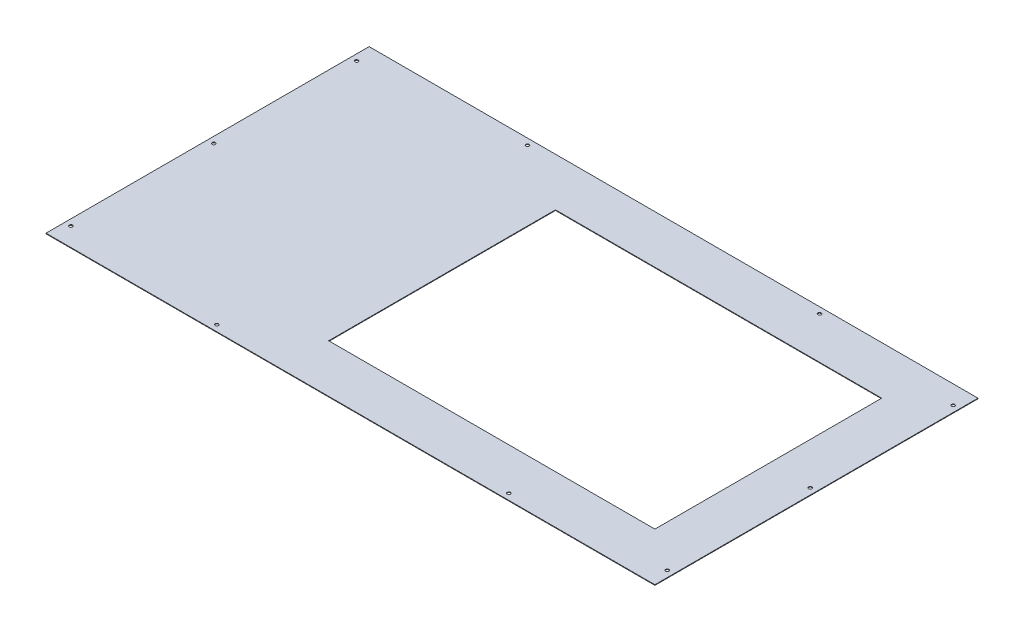
ISO-10303-21;
HEADER;
FILE_DESCRIPTION(('STEP AP214'),'2;1');
FILE_NAME('part.step','',(''),(''),'','','');
FILE_SCHEMA(('AUTOMOTIVE_DESIGN { 1 0 10303 214 1 1 1 1 }'));
ENDSEC;
DATA;
#1=APPLICATION_CONTEXT('core data for automotive mechanical design processes');
#2=APPLICATION_PROTOCOL_DEFINITION('international standard','automotive_design',2000,#1);
#3=PRODUCT_CONTEXT('',#1,'mechanical');
#4=PRODUCT('Part','Part','',(#3));
#5=PRODUCT_RELATED_PRODUCT_CATEGORY('part','',(#4));
#6=PRODUCT_DEFINITION_FORMATION('','',#4);
#7=PRODUCT_DEFINITION_CONTEXT('part definition',#1,'design');
#8=PRODUCT_DEFINITION('design','',#6,#7);
#9=PRODUCT_DEFINITION_SHAPE('','',#8);
#10=(LENGTH_UNIT() NAMED_UNIT(*) SI_UNIT(.MILLI.,.METRE.));
#11=(NAMED_UNIT(*) PLANE_ANGLE_UNIT() SI_UNIT($,.RADIAN.));
#12=(NAMED_UNIT(*) SI_UNIT($,.STERADIAN.) SOLID_ANGLE_UNIT());
#13=UNCERTAINTY_MEASURE_WITH_UNIT(LENGTH_MEASURE(1.E-05),#10,'distance_accuracy_value','');
#14=(GEOMETRIC_REPRESENTATION_CONTEXT(3) GLOBAL_UNCERTAINTY_ASSIGNED_CONTEXT((#13)) GLOBAL_UNIT_ASSIGNED_CONTEXT((#10,
#11,#12)) REPRESENTATION_CONTEXT('',''));
#15=CARTESIAN_POINT('',(0.,0.,0.));
#16=DIRECTION('',(0.,0.,1.));
#17=DIRECTION('',(1.,0.,0.));
#18=AXIS2_PLACEMENT_3D('',#15,#16,#17);
#19=CARTESIAN_POINT('',(0.,1.2192,0.));
#20=DIRECTION('',(0.,1.,0.));
#21=DIRECTION('',(0.,0.,1.));
#22=AXIS2_PLACEMENT_3D('',#19,#20,#21);
#23=PLANE('',#22);
#24=CARTESIAN_POINT('',(-968.76517279528,1.2192,-241.091550628771));
#25=DIRECTION('',(0.,-1.,0.));
#26=DIRECTION('',(0.,0.,-1.));
#27=AXIS2_PLACEMENT_3D('',#24,#25,#26);
#28=CIRCLE('',#27,3.3782);
#29=CARTESIAN_POINT('',(-968.76517279528,1.2192,-244.469750628771));
#30=VERTEX_POINT('',#29);
#31=EDGE_CURVE('E260',#30,#30,#28,.T.);
#32=ORIENTED_EDGE('',*,*,#31,.T.);
#33=EDGE_LOOP('',(#32));
#34=FACE_BOUND('',#33,.T.);
#35=CARTESIAN_POINT('',(-968.76517279528,1.2192,51.0084493712292));
#36=DIRECTION('',(0.,-1.,0.));
#37=DIRECTION('',(0.,0.,-1.));
#38=AXIS2_PLACEMENT_3D('',#35,#36,#37);
#39=CIRCLE('',#38,3.3782);
#40=CARTESIAN_POINT('',(-968.76517279528,1.2192,47.6302493712292));
#41=VERTEX_POINT('',#40);
#42=EDGE_CURVE('E270',#41,#41,#39,.T.);
#43=ORIENTED_EDGE('',*,*,#42,.T.);
#44=EDGE_LOOP('',(#43));
#45=FACE_BOUND('',#44,.T.);
#46=CARTESIAN_POINT('',(-968.76517279528,1.2192,343.108449371229));
#47=DIRECTION('',(0.,-1.,0.));
#48=DIRECTION('',(0.,0.,-1.));
#49=AXIS2_PLACEMENT_3D('',#46,#47,#48);
#50=CIRCLE('',#49,3.3782);
#51=CARTESIAN_POINT('',(-968.76517279528,1.2192,339.730249371229));
#52=VERTEX_POINT('',#51);
#53=EDGE_CURVE('E276',#52,#52,#50,.T.);
#54=ORIENTED_EDGE('',*,*,#53,.T.);
#55=EDGE_LOOP('',(#54));
#56=FACE_BOUND('',#55,.T.);
#57=CARTESIAN_POINT('',(-644.915172795279,1.2192,368.508449371229));
#58=DIRECTION('',(0.,-1.,0.));
#59=DIRECTION('',(0.,0.,-1.));
#60=AXIS2_PLACEMENT_3D('',#57,#58,#59);
#61=CIRCLE('',#60,3.3782);
#62=CARTESIAN_POINT('',(-644.915172795279,1.2192,365.130249371229));
#63=VERTEX_POINT('',#62);
#64=EDGE_CURVE('E282',#63,#63,#61,.T.);
#65=ORIENTED_EDGE('',*,*,#64,.T.);
#66=EDGE_LOOP('',(#65));
#67=FACE_BOUND('',#66,.T.);
#68=CARTESIAN_POINT('',(-644.915172795279,1.2192,-266.491550628771));
#69=DIRECTION('',(0.,-1.,0.));
#70=DIRECTION('',(0.,0.,-1.));
#71=AXIS2_PLACEMENT_3D('',#68,#69,#70);
#72=CIRCLE('',#71,3.3782);
#73=CARTESIAN_POINT('',(-644.915172795279,1.2192,-269.869750628771));
#74=VERTEX_POINT('',#73);
#75=EDGE_CURVE('E288',#74,#74,#72,.T.);
#76=ORIENTED_EDGE('',*,*,#75,.T.);
#77=EDGE_LOOP('',(#76));
#78=FACE_BOUND('',#77,.T.);
#79=CARTESIAN_POINT('',(-48.0151727952794,1.2192,-266.491550628771));
#80=DIRECTION('',(0.,-1.,0.));
#81=DIRECTION('',(0.,0.,-1.));
#82=AXIS2_PLACEMENT_3D('',#79,#80,#81);
#83=CIRCLE('',#82,3.3782);
#84=CARTESIAN_POINT('',(-48.0151727952794,1.2192,-269.869750628771));
#85=VERTEX_POINT('',#84);
#86=EDGE_CURVE('E294',#85,#85,#83,.T.);
#87=ORIENTED_EDGE('',*,*,#86,.T.);
#88=EDGE_LOOP('',(#87));
#89=FACE_BOUND('',#88,.T.);
#90=CARTESIAN_POINT('',(250.434827204721,1.2192,-241.091550628771));
#91=DIRECTION('',(0.,-1.,0.));
#92=DIRECTION('',(0.,0.,-1.));
#93=AXIS2_PLACEMENT_3D('',#90,#91,#92);
#94=CIRCLE('',#93,3.3782);
#95=CARTESIAN_POINT('',(250.434827204721,1.2192,-244.469750628771));
#96=VERTEX_POINT('',#95);
#97=EDGE_CURVE('E300',#96,#96,#94,.T.);
#98=ORIENTED_EDGE('',*,*,#97,.T.);
#99=EDGE_LOOP('',(#98));
#100=FACE_BOUND('',#99,.T.);
#101=CARTESIAN_POINT('',(250.434827204721,1.2192,51.0084493712292));
#102=DIRECTION('',(0.,-1.,0.));
#103=DIRECTION('',(0.,0.,-1.));
#104=AXIS2_PLACEMENT_3D('',#101,#102,#103);
#105=CIRCLE('',#104,3.3782);
#106=CARTESIAN_POINT('',(250.434827204721,1.2192,47.6302493712292));
#107=VERTEX_POINT('',#106);
#108=EDGE_CURVE('E306',#107,#107,#105,.T.);
#109=ORIENTED_EDGE('',*,*,#108,.T.);
#110=EDGE_LOOP('',(#109));
#111=FACE_BOUND('',#110,.T.);
#112=CARTESIAN_POINT('',(250.434827204721,1.2192,343.108449371229));
#113=DIRECTION('',(0.,-1.,0.));
#114=DIRECTION('',(0.,0.,-1.));
#115=AXIS2_PLACEMENT_3D('',#112,#113,#114);
#116=CIRCLE('',#115,3.3782);
#117=CARTESIAN_POINT('',(250.434827204721,1.2192,339.730249371229));
#118=VERTEX_POINT('',#117);
#119=EDGE_CURVE('E312',#118,#118,#116,.T.);
#120=ORIENTED_EDGE('',*,*,#119,.T.);
#121=EDGE_LOOP('',(#120));
#122=FACE_BOUND('',#121,.T.);
#123=CARTESIAN_POINT('',(-48.0151727952794,1.2192,368.508449371229));
#124=DIRECTION('',(0.,-1.,0.));
#125=DIRECTION('',(0.,0.,-1.));
#126=AXIS2_PLACEMENT_3D('',#123,#124,#125);
#127=CIRCLE('',#126,3.3782);
#128=CARTESIAN_POINT('',(-48.0151727952794,1.2192,365.130249371229));
#129=VERTEX_POINT('',#128);
#130=EDGE_CURVE('E127',#129,#129,#127,.T.);
#131=ORIENTED_EDGE('',*,*,#130,.T.);
#132=EDGE_LOOP('',(#131));
#133=FACE_BOUND('',#132,.T.);
#134=DIRECTION('',(0.,0.,1.));
#135=VECTOR('',#134,1.);
#136=CARTESIAN_POINT('',(-981.46517279528,1.2192,-279.191550628771));
#137=LINE('',#136,#135);
#138=CARTESIAN_POINT('',(-981.46517279528,1.2192,-279.191550628771));
#139=VERTEX_POINT('',#138);
#140=CARTESIAN_POINT('',(-981.46517279528,1.2192,381.208449371229));
#141=VERTEX_POINT('',#140);
#142=EDGE_CURVE('E137',#139,#141,#137,.T.);
#143=ORIENTED_EDGE('',*,*,#142,.T.);
#144=DIRECTION('',(1.,0.,0.));
#145=VECTOR('',#144,1.);
#146=CARTESIAN_POINT('',(-981.46517279528,1.2192,381.208449371229));
#147=LINE('',#146,#145);
#148=CARTESIAN_POINT('',(263.13482720472,1.2192,381.208449371229));
#149=VERTEX_POINT('',#148);
#150=EDGE_CURVE('E140',#141,#149,#147,.T.);
#151=ORIENTED_EDGE('',*,*,#150,.T.);
#152=DIRECTION('',(0.,0.,-1.));
#153=VECTOR('',#152,1.);
#154=CARTESIAN_POINT('',(263.13482720472,1.2192,-279.191550628771));
#155=LINE('',#154,#153);
#156=CARTESIAN_POINT('',(263.13482720472,1.2192,-279.191550628771));
#157=VERTEX_POINT('',#156);
#158=EDGE_CURVE('E143',#149,#157,#155,.T.);
#159=ORIENTED_EDGE('',*,*,#158,.T.);
#160=DIRECTION('',(-1.,0.,0.));
#161=VECTOR('',#160,1.);
#162=CARTESIAN_POINT('',(-981.46517279528,1.2192,-279.191550628771));
#163=LINE('',#162,#161);
#164=EDGE_CURVE('E145',#157,#139,#163,.T.);
#165=ORIENTED_EDGE('',*,*,#164,.T.);
#166=EDGE_LOOP('',(#143,#151,#159,#165));
#167=FACE_BOUND('',#166,.T.);
#168=DIRECTION('',(1.,0.,0.));
#169=VECTOR('',#168,1.);
#170=CARTESIAN_POINT('',(-502.040172795279,1.2192,282.783449371229));
#171=LINE('',#170,#169);
#172=CARTESIAN_POINT('',(-502.040172795279,1.2192,282.783449371229));
#173=VERTEX_POINT('',#172);
#174=CARTESIAN_POINT('',(164.70982720472,1.2192,282.783449371229));
#175=VERTEX_POINT('',#174);
#176=EDGE_CURVE('E107',#173,#175,#171,.T.);
#177=ORIENTED_EDGE('',*,*,#176,.F.);
#178=DIRECTION('',(0.,0.,1.));
#179=VECTOR('',#178,1.);
#180=CARTESIAN_POINT('',(-502.04017279528,1.2192,-180.766550628771));
#181=LINE('',#180,#179);
#182=CARTESIAN_POINT('',(-502.04017279528,1.2192,-180.766550628771));
#183=VERTEX_POINT('',#182);
#184=EDGE_CURVE('E99',#183,#173,#181,.T.);
#185=ORIENTED_EDGE('',*,*,#184,.F.);
#186=DIRECTION('',(-1.,0.,0.));
#187=VECTOR('',#186,1.);
#188=CARTESIAN_POINT('',(-502.04017279528,1.2192,-180.766550628771));
#189=LINE('',#188,#187);
#190=CARTESIAN_POINT('',(164.70982720472,1.2192,-180.766550628771));
#191=VERTEX_POINT('',#190);
#192=EDGE_CURVE('E121',#191,#183,#189,.T.);
#193=ORIENTED_EDGE('',*,*,#192,.F.);
#194=DIRECTION('',(0.,0.,-1.));
#195=VECTOR('',#194,1.);
#196=CARTESIAN_POINT('',(164.70982720472,1.2192,-180.766550628771));
#197=LINE('',#196,#195);
#198=EDGE_CURVE('E119',#175,#191,#197,.T.);
#199=ORIENTED_EDGE('',*,*,#198,.F.);
#200=EDGE_LOOP('',(#177,#185,#193,#199));
#201=FACE_BOUND('',#200,.T.);
#202=ADVANCED_FACE('F34',(#34,#45,#56,#67,#78,#89,#100,#111,#122,#133,#167,#201),#23,.T.);
#203=CARTESIAN_POINT('',(0.,0.,0.));
#204=DIRECTION('',(0.,1.,0.));
#205=DIRECTION('',(0.,0.,1.));
#206=AXIS2_PLACEMENT_3D('',#203,#204,#205);
#207=PLANE('',#206);
#208=CARTESIAN_POINT('',(-968.76517279528,0.,-241.091550628771));
#209=DIRECTION('',(0.,-1.,0.));
#210=DIRECTION('',(0.,0.,-1.));
#211=AXIS2_PLACEMENT_3D('',#208,#209,#210);
#212=CIRCLE('',#211,3.3782);
#213=CARTESIAN_POINT('',(-968.76517279528,0.,-244.469750628771));
#214=VERTEX_POINT('',#213);
#215=EDGE_CURVE('E263',#214,#214,#212,.T.);
#216=ORIENTED_EDGE('',*,*,#215,.F.);
#217=EDGE_LOOP('',(#216));
#218=FACE_BOUND('',#217,.T.);
#219=CARTESIAN_POINT('',(-968.76517279528,0.,51.0084493712292));
#220=DIRECTION('',(0.,-1.,0.));
#221=DIRECTION('',(0.,0.,-1.));
#222=AXIS2_PLACEMENT_3D('',#219,#220,#221);
#223=CIRCLE('',#222,3.3782);
#224=CARTESIAN_POINT('',(-968.76517279528,0.,47.6302493712292));
#225=VERTEX_POINT('',#224);
#226=EDGE_CURVE('E265',#225,#225,#223,.T.);
#227=ORIENTED_EDGE('',*,*,#226,.F.);
#228=EDGE_LOOP('',(#227));
#229=FACE_BOUND('',#228,.T.);
#230=CARTESIAN_POINT('',(-968.76517279528,0.,343.108449371229));
#231=DIRECTION('',(0.,-1.,0.));
#232=DIRECTION('',(0.,0.,-1.));
#233=AXIS2_PLACEMENT_3D('',#230,#231,#232);
#234=CIRCLE('',#233,3.3782);
#235=CARTESIAN_POINT('',(-968.76517279528,0.,339.730249371229));
#236=VERTEX_POINT('',#235);
#237=EDGE_CURVE('E273',#236,#236,#234,.T.);
#238=ORIENTED_EDGE('',*,*,#237,.F.);
#239=EDGE_LOOP('',(#238));
#240=FACE_BOUND('',#239,.T.);
#241=CARTESIAN_POINT('',(-644.915172795279,0.,368.508449371229));
#242=DIRECTION('',(0.,-1.,0.));
#243=DIRECTION('',(0.,0.,-1.));
#244=AXIS2_PLACEMENT_3D('',#241,#242,#243);
#245=CIRCLE('',#244,3.3782);
#246=CARTESIAN_POINT('',(-644.915172795279,0.,365.130249371229));
#247=VERTEX_POINT('',#246);
#248=EDGE_CURVE('E279',#247,#247,#245,.T.);
#249=ORIENTED_EDGE('',*,*,#248,.F.);
#250=EDGE_LOOP('',(#249));
#251=FACE_BOUND('',#250,.T.);
#252=CARTESIAN_POINT('',(-644.915172795279,0.,-266.491550628771));
#253=DIRECTION('',(0.,-1.,0.));
#254=DIRECTION('',(0.,0.,-1.));
#255=AXIS2_PLACEMENT_3D('',#252,#253,#254);
#256=CIRCLE('',#255,3.3782);
#257=CARTESIAN_POINT('',(-644.915172795279,0.,-269.869750628771));
#258=VERTEX_POINT('',#257);
#259=EDGE_CURVE('E285',#258,#258,#256,.T.);
#260=ORIENTED_EDGE('',*,*,#259,.F.);
#261=EDGE_LOOP('',(#260));
#262=FACE_BOUND('',#261,.T.);
#263=CARTESIAN_POINT('',(-48.0151727952794,0.,-266.491550628771));
#264=DIRECTION('',(0.,-1.,0.));
#265=DIRECTION('',(0.,0.,-1.));
#266=AXIS2_PLACEMENT_3D('',#263,#264,#265);
#267=CIRCLE('',#266,3.37819999999998);
#268=CARTESIAN_POINT('',(-48.0151727952794,0.,-269.869750628771));
#269=VERTEX_POINT('',#268);
#270=EDGE_CURVE('E291',#269,#269,#267,.T.);
#271=ORIENTED_EDGE('',*,*,#270,.F.);
#272=EDGE_LOOP('',(#271));
#273=FACE_BOUND('',#272,.T.);
#274=CARTESIAN_POINT('',(250.434827204721,0.,-241.091550628771));
#275=DIRECTION('',(0.,-1.,0.));
#276=DIRECTION('',(0.,0.,-1.));
#277=AXIS2_PLACEMENT_3D('',#274,#275,#276);
#278=CIRCLE('',#277,3.3782);
#279=CARTESIAN_POINT('',(250.434827204721,0.,-244.469750628771));
#280=VERTEX_POINT('',#279);
#281=EDGE_CURVE('E297',#280,#280,#278,.T.);
#282=ORIENTED_EDGE('',*,*,#281,.F.);
#283=EDGE_LOOP('',(#282));
#284=FACE_BOUND('',#283,.T.);
#285=CARTESIAN_POINT('',(250.434827204721,0.,51.0084493712292));
#286=DIRECTION('',(0.,-1.,0.));
#287=DIRECTION('',(0.,0.,-1.));
#288=AXIS2_PLACEMENT_3D('',#285,#286,#287);
#289=CIRCLE('',#288,3.3782);
#290=CARTESIAN_POINT('',(250.434827204721,0.,47.6302493712292));
#291=VERTEX_POINT('',#290);
#292=EDGE_CURVE('E303',#291,#291,#289,.T.);
#293=ORIENTED_EDGE('',*,*,#292,.F.);
#294=EDGE_LOOP('',(#293));
#295=FACE_BOUND('',#294,.T.);
#296=CARTESIAN_POINT('',(250.434827204721,0.,343.108449371229));
#297=DIRECTION('',(0.,-1.,0.));
#298=DIRECTION('',(0.,0.,-1.));
#299=AXIS2_PLACEMENT_3D('',#296,#297,#298);
#300=CIRCLE('',#299,3.3782);
#301=CARTESIAN_POINT('',(250.434827204721,0.,339.730249371229));
#302=VERTEX_POINT('',#301);
#303=EDGE_CURVE('E309',#302,#302,#300,.T.);
#304=ORIENTED_EDGE('',*,*,#303,.F.);
#305=EDGE_LOOP('',(#304));
#306=FACE_BOUND('',#305,.T.);
#307=CARTESIAN_POINT('',(-48.0151727952794,0.,368.508449371229));
#308=DIRECTION('',(0.,-1.,0.));
#309=DIRECTION('',(0.,0.,-1.));
#310=AXIS2_PLACEMENT_3D('',#307,#308,#309);
#311=CIRCLE('',#310,3.37819999999998);
#312=CARTESIAN_POINT('',(-48.0151727952794,0.,365.130249371229));
#313=VERTEX_POINT('',#312);
#314=EDGE_CURVE('E315',#313,#313,#311,.T.);
#315=ORIENTED_EDGE('',*,*,#314,.F.);
#316=EDGE_LOOP('',(#315));
#317=FACE_BOUND('',#316,.T.);
#318=DIRECTION('',(0.,0.,1.));
#319=VECTOR('',#318,1.);
#320=CARTESIAN_POINT('',(-981.46517279528,0.,-279.191550628771));
#321=LINE('',#320,#319);
#322=CARTESIAN_POINT('',(-981.46517279528,0.,-279.191550628771));
#323=VERTEX_POINT('',#322);
#324=CARTESIAN_POINT('',(-981.46517279528,0.,381.208449371229));
#325=VERTEX_POINT('',#324);
#326=EDGE_CURVE('E115',#323,#325,#321,.T.);
#327=ORIENTED_EDGE('',*,*,#326,.F.);
#328=DIRECTION('',(-1.,0.,0.));
#329=VECTOR('',#328,1.);
#330=CARTESIAN_POINT('',(-981.46517279528,0.,-279.191550628771));
#331=LINE('',#330,#329);
#332=CARTESIAN_POINT('',(263.13482720472,0.,-279.191550628771));
#333=VERTEX_POINT('',#332);
#334=EDGE_CURVE('E141',#333,#323,#331,.T.);
#335=ORIENTED_EDGE('',*,*,#334,.F.);
#336=DIRECTION('',(0.,0.,-1.));
#337=VECTOR('',#336,1.);
#338=CARTESIAN_POINT('',(263.13482720472,0.,-279.191550628771));
#339=LINE('',#338,#337);
#340=CARTESIAN_POINT('',(263.13482720472,0.,381.208449371229));
#341=VERTEX_POINT('',#340);
#342=EDGE_CURVE('E152',#341,#333,#339,.T.);
#343=ORIENTED_EDGE('',*,*,#342,.F.);
#344=DIRECTION('',(1.,0.,0.));
#345=VECTOR('',#344,1.);
#346=CARTESIAN_POINT('',(-981.46517279528,0.,381.208449371229));
#347=LINE('',#346,#345);
#348=EDGE_CURVE('E150',#325,#341,#347,.T.);
#349=ORIENTED_EDGE('',*,*,#348,.F.);
#350=EDGE_LOOP('',(#327,#335,#343,#349));
#351=FACE_BOUND('',#350,.T.);
#352=DIRECTION('',(0.,0.,1.));
#353=VECTOR('',#352,1.);
#354=CARTESIAN_POINT('',(-502.04017279528,0.,-180.766550628771));
#355=LINE('',#354,#353);
#356=CARTESIAN_POINT('',(-502.04017279528,0.,-180.766550628771));
#357=VERTEX_POINT('',#356);
#358=CARTESIAN_POINT('',(-502.040172795279,0.,282.783449371229));
#359=VERTEX_POINT('',#358);
#360=EDGE_CURVE('E57',#357,#359,#355,.T.);
#361=ORIENTED_EDGE('',*,*,#360,.T.);
#362=DIRECTION('',(1.,0.,0.));
#363=VECTOR('',#362,1.);
#364=CARTESIAN_POINT('',(-502.040172795279,0.,282.783449371229));
#365=LINE('',#364,#363);
#366=CARTESIAN_POINT('',(164.70982720472,0.,282.783449371229));
#367=VERTEX_POINT('',#366);
#368=EDGE_CURVE('E114',#359,#367,#365,.T.);
#369=ORIENTED_EDGE('',*,*,#368,.T.);
#370=DIRECTION('',(0.,0.,-1.));
#371=VECTOR('',#370,1.);
#372=CARTESIAN_POINT('',(164.70982720472,0.,-180.766550628771));
#373=LINE('',#372,#371);
#374=CARTESIAN_POINT('',(164.70982720472,0.,-180.766550628771));
#375=VERTEX_POINT('',#374);
#376=EDGE_CURVE('E129',#367,#375,#373,.T.);
#377=ORIENTED_EDGE('',*,*,#376,.T.);
#378=DIRECTION('',(-1.,0.,0.));
#379=VECTOR('',#378,1.);
#380=CARTESIAN_POINT('',(-502.04017279528,0.,-180.766550628771));
#381=LINE('',#380,#379);
#382=EDGE_CURVE('E108',#375,#357,#381,.T.);
#383=ORIENTED_EDGE('',*,*,#382,.T.);
#384=EDGE_LOOP('',(#361,#369,#377,#383));
#385=FACE_BOUND('',#384,.T.);
#386=ADVANCED_FACE('F170',(#218,#229,#240,#251,#262,#273,#284,#295,#306,#317,#351,#385),#207,.F.);
#387=CARTESIAN_POINT('',(-981.46517279528,1.2192,-279.191550628771));
#388=DIRECTION('',(1.,0.,0.));
#389=DIRECTION('',(0.,0.,-1.));
#390=AXIS2_PLACEMENT_3D('',#387,#388,#389);
#391=PLANE('',#390);
#392=ORIENTED_EDGE('',*,*,#326,.T.);
#393=DIRECTION('',(0.,-1.,0.));
#394=VECTOR('',#393,1.);
#395=CARTESIAN_POINT('',(-981.46517279528,1.2192,381.208449371229));
#396=LINE('',#395,#394);
#397=EDGE_CURVE('E11',#141,#325,#396,.T.);
#398=ORIENTED_EDGE('',*,*,#397,.F.);
#399=ORIENTED_EDGE('',*,*,#142,.F.);
#400=DIRECTION('',(0.,-1.,0.));
#401=VECTOR('',#400,1.);
#402=CARTESIAN_POINT('',(-981.46517279528,1.2192,-279.191550628771));
#403=LINE('',#402,#401);
#404=EDGE_CURVE('E147',#139,#323,#403,.T.);
#405=ORIENTED_EDGE('',*,*,#404,.T.);
#406=EDGE_LOOP('',(#392,#398,#399,#405));
#407=FACE_BOUND('',#406,.T.);
#408=ADVANCED_FACE('F36',(#407),#391,.F.);
#409=CARTESIAN_POINT('',(-981.46517279528,1.2192,381.208449371229));
#410=DIRECTION('',(0.,0.,-1.));
#411=DIRECTION('',(-1.,0.,0.));
#412=AXIS2_PLACEMENT_3D('',#409,#410,#411);
#413=PLANE('',#412);
#414=ORIENTED_EDGE('',*,*,#348,.T.);
#415=DIRECTION('',(0.,-1.,0.));
#416=VECTOR('',#415,1.);
#417=CARTESIAN_POINT('',(263.13482720472,1.2192,381.208449371229));
#418=LINE('',#417,#416);
#419=EDGE_CURVE('E42',#149,#341,#418,.T.);
#420=ORIENTED_EDGE('',*,*,#419,.F.);
#421=ORIENTED_EDGE('',*,*,#150,.F.);
#422=ORIENTED_EDGE('',*,*,#397,.T.);
#423=EDGE_LOOP('',(#414,#420,#421,#422));
#424=FACE_BOUND('',#423,.T.);
#425=ADVANCED_FACE('F180',(#424),#413,.F.);
#426=CARTESIAN_POINT('',(263.13482720472,1.2192,-279.191550628771));
#427=DIRECTION('',(-1.,0.,0.));
#428=DIRECTION('',(0.,0.,1.));
#429=AXIS2_PLACEMENT_3D('',#426,#427,#428);
#430=PLANE('',#429);
#431=ORIENTED_EDGE('',*,*,#342,.T.);
#432=DIRECTION('',(0.,-1.,0.));
#433=VECTOR('',#432,1.);
#434=CARTESIAN_POINT('',(263.13482720472,1.2192,-279.191550628771));
#435=LINE('',#434,#433);
#436=EDGE_CURVE('E157',#157,#333,#435,.T.);
#437=ORIENTED_EDGE('',*,*,#436,.F.);
#438=ORIENTED_EDGE('',*,*,#158,.F.);
#439=ORIENTED_EDGE('',*,*,#419,.T.);
#440=EDGE_LOOP('',(#431,#437,#438,#439));
#441=FACE_BOUND('',#440,.T.);
#442=ADVANCED_FACE('F164',(#441),#430,.F.);
#443=CARTESIAN_POINT('',(-981.46517279528,1.2192,-279.191550628771));
#444=DIRECTION('',(0.,0.,1.));
#445=DIRECTION('',(1.,0.,0.));
#446=AXIS2_PLACEMENT_3D('',#443,#444,#445);
#447=PLANE('',#446);
#448=ORIENTED_EDGE('',*,*,#334,.T.);
#449=ORIENTED_EDGE('',*,*,#404,.F.);
#450=ORIENTED_EDGE('',*,*,#164,.F.);
#451=ORIENTED_EDGE('',*,*,#436,.T.);
#452=EDGE_LOOP('',(#448,#449,#450,#451));
#453=FACE_BOUND('',#452,.T.);
#454=ADVANCED_FACE('F174',(#453),#447,.F.);
#455=CARTESIAN_POINT('',(-502.04017279528,1.2192,-180.766550628771));
#456=DIRECTION('',(1.,0.,0.));
#457=DIRECTION('',(0.,0.,-1.));
#458=AXIS2_PLACEMENT_3D('',#455,#456,#457);
#459=PLANE('',#458);
#460=ORIENTED_EDGE('',*,*,#360,.F.);
#461=DIRECTION('',(0.,-1.,0.));
#462=VECTOR('',#461,1.);
#463=CARTESIAN_POINT('',(-502.04017279528,1.2192,-180.766550628771));
#464=LINE('',#463,#462);
#465=EDGE_CURVE('E103',#183,#357,#464,.T.);
#466=ORIENTED_EDGE('',*,*,#465,.F.);
#467=ORIENTED_EDGE('',*,*,#184,.T.);
#468=DIRECTION('',(0.,-1.,0.));
#469=VECTOR('',#468,1.);
#470=CARTESIAN_POINT('',(-502.040172795279,1.2192,282.783449371229));
#471=LINE('',#470,#469);
#472=EDGE_CURVE('E102',#173,#359,#471,.T.);
#473=ORIENTED_EDGE('',*,*,#472,.T.);
#474=EDGE_LOOP('',(#460,#466,#467,#473));
#475=FACE_BOUND('',#474,.T.);
#476=ADVANCED_FACE('F101',(#475),#459,.T.);
#477=CARTESIAN_POINT('',(-502.040172795279,1.2192,282.783449371229));
#478=DIRECTION('',(0.,0.,-1.));
#479=DIRECTION('',(-1.,0.,0.));
#480=AXIS2_PLACEMENT_3D('',#477,#478,#479);
#481=PLANE('',#480);
#482=ORIENTED_EDGE('',*,*,#368,.F.);
#483=ORIENTED_EDGE('',*,*,#472,.F.);
#484=ORIENTED_EDGE('',*,*,#176,.T.);
#485=DIRECTION('',(0.,-1.,0.));
#486=VECTOR('',#485,1.);
#487=CARTESIAN_POINT('',(164.70982720472,1.2192,282.783449371229));
#488=LINE('',#487,#486);
#489=EDGE_CURVE('E116',#175,#367,#488,.T.);
#490=ORIENTED_EDGE('',*,*,#489,.T.);
#491=EDGE_LOOP('',(#482,#483,#484,#490));
#492=FACE_BOUND('',#491,.T.);
#493=ADVANCED_FACE('F111',(#492),#481,.T.);
#494=CARTESIAN_POINT('',(164.70982720472,1.2192,-180.766550628771));
#495=DIRECTION('',(-1.,0.,0.));
#496=DIRECTION('',(0.,0.,1.));
#497=AXIS2_PLACEMENT_3D('',#494,#495,#496);
#498=PLANE('',#497);
#499=ORIENTED_EDGE('',*,*,#376,.F.);
#500=ORIENTED_EDGE('',*,*,#489,.F.);
#501=ORIENTED_EDGE('',*,*,#198,.T.);
#502=DIRECTION('',(0.,-1.,0.));
#503=VECTOR('',#502,1.);
#504=CARTESIAN_POINT('',(164.70982720472,1.2192,-180.766550628771));
#505=LINE('',#504,#503);
#506=EDGE_CURVE('E49',#191,#375,#505,.T.);
#507=ORIENTED_EDGE('',*,*,#506,.T.);
#508=EDGE_LOOP('',(#499,#500,#501,#507));
#509=FACE_BOUND('',#508,.T.);
#510=ADVANCED_FACE('F207',(#509),#498,.T.);
#511=CARTESIAN_POINT('',(-502.04017279528,1.2192,-180.766550628771));
#512=DIRECTION('',(0.,0.,1.));
#513=DIRECTION('',(1.,0.,0.));
#514=AXIS2_PLACEMENT_3D('',#511,#512,#513);
#515=PLANE('',#514);
#516=ORIENTED_EDGE('',*,*,#382,.F.);
#517=ORIENTED_EDGE('',*,*,#506,.F.);
#518=ORIENTED_EDGE('',*,*,#192,.T.);
#519=ORIENTED_EDGE('',*,*,#465,.T.);
#520=EDGE_LOOP('',(#516,#517,#518,#519));
#521=FACE_BOUND('',#520,.T.);
#522=ADVANCED_FACE('F211',(#521),#515,.T.);
#523=CARTESIAN_POINT('',(-48.0151727952794,0.,368.508449371229));
#524=DIRECTION('',(0.,-1.,0.));
#525=DIRECTION('',(0.,0.,-1.));
#526=AXIS2_PLACEMENT_3D('',#523,#524,#525);
#527=CYLINDRICAL_SURFACE('',#526,3.37819999999999);
#528=ORIENTED_EDGE('',*,*,#130,.F.);
#529=EDGE_LOOP('',(#528));
#530=FACE_BOUND('',#529,.T.);
#531=ORIENTED_EDGE('',*,*,#314,.T.);
#532=EDGE_LOOP('',(#531));
#533=FACE_BOUND('',#532,.T.);
#534=ADVANCED_FACE('F217',(#530,#533),#527,.F.);
#535=CARTESIAN_POINT('',(250.434827204721,0.,343.108449371229));
#536=DIRECTION('',(0.,-1.,0.));
#537=DIRECTION('',(0.,0.,-1.));
#538=AXIS2_PLACEMENT_3D('',#535,#536,#537);
#539=CYLINDRICAL_SURFACE('',#538,3.3782);
#540=ORIENTED_EDGE('',*,*,#119,.F.);
#541=EDGE_LOOP('',(#540));
#542=FACE_BOUND('',#541,.T.);
#543=ORIENTED_EDGE('',*,*,#303,.T.);
#544=EDGE_LOOP('',(#543));
#545=FACE_BOUND('',#544,.T.);
#546=ADVANCED_FACE('F220',(#542,#545),#539,.F.);
#547=CARTESIAN_POINT('',(250.434827204721,0.,51.0084493712292));
#548=DIRECTION('',(0.,-1.,0.));
#549=DIRECTION('',(0.,0.,-1.));
#550=AXIS2_PLACEMENT_3D('',#547,#548,#549);
#551=CYLINDRICAL_SURFACE('',#550,3.3782);
#552=ORIENTED_EDGE('',*,*,#108,.F.);
#553=EDGE_LOOP('',(#552));
#554=FACE_BOUND('',#553,.T.);
#555=ORIENTED_EDGE('',*,*,#292,.T.);
#556=EDGE_LOOP('',(#555));
#557=FACE_BOUND('',#556,.T.);
#558=ADVANCED_FACE('F224',(#554,#557),#551,.F.);
#559=CARTESIAN_POINT('',(250.434827204721,0.,-241.091550628771));
#560=DIRECTION('',(0.,-1.,0.));
#561=DIRECTION('',(0.,0.,-1.));
#562=AXIS2_PLACEMENT_3D('',#559,#560,#561);
#563=CYLINDRICAL_SURFACE('',#562,3.3782);
#564=ORIENTED_EDGE('',*,*,#97,.F.);
#565=EDGE_LOOP('',(#564));
#566=FACE_BOUND('',#565,.T.);
#567=ORIENTED_EDGE('',*,*,#281,.T.);
#568=EDGE_LOOP('',(#567));
#569=FACE_BOUND('',#568,.T.);
#570=ADVANCED_FACE('F228',(#566,#569),#563,.F.);
#571=CARTESIAN_POINT('',(-48.0151727952794,0.,-266.491550628771));
#572=DIRECTION('',(0.,-1.,0.));
#573=DIRECTION('',(0.,0.,-1.));
#574=AXIS2_PLACEMENT_3D('',#571,#572,#573);
#575=CYLINDRICAL_SURFACE('',#574,3.37819999999999);
#576=ORIENTED_EDGE('',*,*,#86,.F.);
#577=EDGE_LOOP('',(#576));
#578=FACE_BOUND('',#577,.T.);
#579=ORIENTED_EDGE('',*,*,#270,.T.);
#580=EDGE_LOOP('',(#579));
#581=FACE_BOUND('',#580,.T.);
#582=ADVANCED_FACE('F232',(#578,#581),#575,.F.);
#583=CARTESIAN_POINT('',(-644.915172795279,0.,-266.491550628771));
#584=DIRECTION('',(0.,-1.,0.));
#585=DIRECTION('',(0.,0.,-1.));
#586=AXIS2_PLACEMENT_3D('',#583,#584,#585);
#587=CYLINDRICAL_SURFACE('',#586,3.3782);
#588=ORIENTED_EDGE('',*,*,#75,.F.);
#589=EDGE_LOOP('',(#588));
#590=FACE_BOUND('',#589,.T.);
#591=ORIENTED_EDGE('',*,*,#259,.T.);
#592=EDGE_LOOP('',(#591));
#593=FACE_BOUND('',#592,.T.);
#594=ADVANCED_FACE('F236',(#590,#593),#587,.F.);
#595=CARTESIAN_POINT('',(-644.915172795279,0.,368.508449371229));
#596=DIRECTION('',(0.,-1.,0.));
#597=DIRECTION('',(0.,0.,-1.));
#598=AXIS2_PLACEMENT_3D('',#595,#596,#597);
#599=CYLINDRICAL_SURFACE('',#598,3.3782);
#600=ORIENTED_EDGE('',*,*,#64,.F.);
#601=EDGE_LOOP('',(#600));
#602=FACE_BOUND('',#601,.T.);
#603=ORIENTED_EDGE('',*,*,#248,.T.);
#604=EDGE_LOOP('',(#603));
#605=FACE_BOUND('',#604,.T.);
#606=ADVANCED_FACE('F240',(#602,#605),#599,.F.);
#607=CARTESIAN_POINT('',(-968.76517279528,0.,343.108449371229));
#608=DIRECTION('',(0.,-1.,0.));
#609=DIRECTION('',(0.,0.,-1.));
#610=AXIS2_PLACEMENT_3D('',#607,#608,#609);
#611=CYLINDRICAL_SURFACE('',#610,3.3782);
#612=ORIENTED_EDGE('',*,*,#53,.F.);
#613=EDGE_LOOP('',(#612));
#614=FACE_BOUND('',#613,.T.);
#615=ORIENTED_EDGE('',*,*,#237,.T.);
#616=EDGE_LOOP('',(#615));
#617=FACE_BOUND('',#616,.T.);
#618=ADVANCED_FACE('F244',(#614,#617),#611,.F.);
#619=CARTESIAN_POINT('',(-968.76517279528,0.,51.0084493712292));
#620=DIRECTION('',(0.,-1.,0.));
#621=DIRECTION('',(0.,0.,-1.));
#622=AXIS2_PLACEMENT_3D('',#619,#620,#621);
#623=CYLINDRICAL_SURFACE('',#622,3.3782);
#624=ORIENTED_EDGE('',*,*,#42,.F.);
#625=EDGE_LOOP('',(#624));
#626=FACE_BOUND('',#625,.T.);
#627=ORIENTED_EDGE('',*,*,#226,.T.);
#628=EDGE_LOOP('',(#627));
#629=FACE_BOUND('',#628,.T.);
#630=ADVANCED_FACE('F248',(#626,#629),#623,.F.);
#631=CARTESIAN_POINT('',(-968.76517279528,0.,-241.091550628771));
#632=DIRECTION('',(0.,-1.,0.));
#633=DIRECTION('',(0.,0.,-1.));
#634=AXIS2_PLACEMENT_3D('',#631,#632,#633);
#635=CYLINDRICAL_SURFACE('',#634,3.3782);
#636=ORIENTED_EDGE('',*,*,#31,.F.);
#637=EDGE_LOOP('',(#636));
#638=FACE_BOUND('',#637,.T.);
#639=ORIENTED_EDGE('',*,*,#215,.T.);
#640=EDGE_LOOP('',(#639));
#641=FACE_BOUND('',#640,.T.);
#642=ADVANCED_FACE('F252',(#638,#641),#635,.F.);
#643=CLOSED_SHELL('',(#202,#386,#408,#425,#442,#454,#476,#493,#510,#522,#534,#546,#558,#570,
#582,#594,#606,#618,#630,#642));
#644=MANIFOLD_SOLID_BREP('B2',#643);
#645=ADVANCED_BREP_SHAPE_REPRESENTATION('',(#18,#644),#14);
#646=SHAPE_DEFINITION_REPRESENTATION(#9,#645);
ENDSEC;
END-ISO-10303-21;
